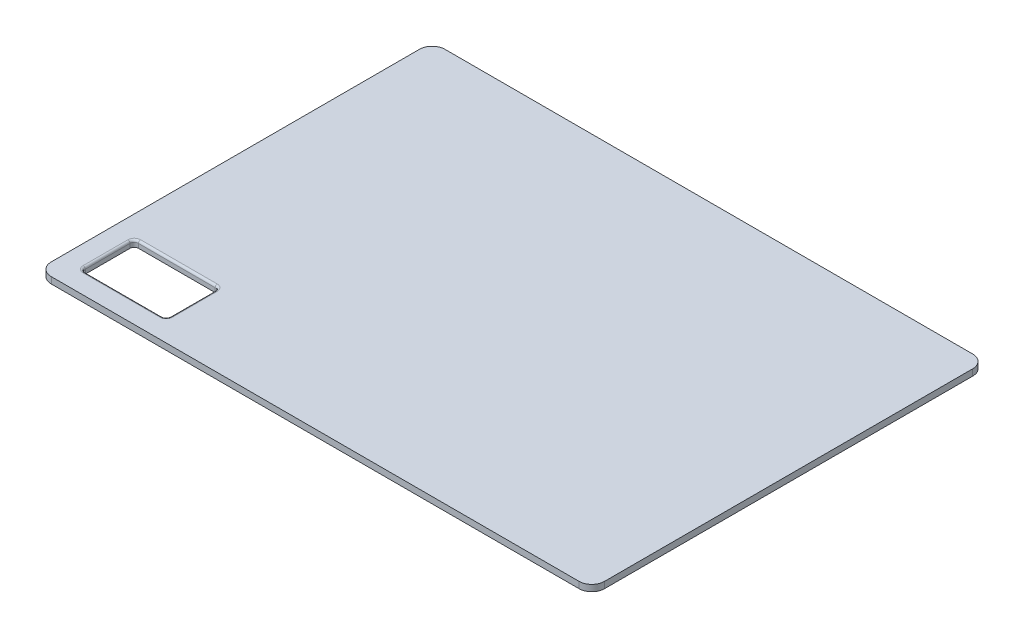
ISO-10303-21;
HEADER;
FILE_DESCRIPTION(('STEP AP214'),'2;1');
FILE_NAME('part.step','',(''),(''),'','','');
FILE_SCHEMA(('AUTOMOTIVE_DESIGN { 1 0 10303 214 1 1 1 1 }'));
ENDSEC;
DATA;
#1=APPLICATION_CONTEXT('core data for automotive mechanical design processes');
#2=APPLICATION_PROTOCOL_DEFINITION('international standard','automotive_design',2000,#1);
#3=PRODUCT_CONTEXT('',#1,'mechanical');
#4=PRODUCT('Part','Part','',(#3));
#5=PRODUCT_RELATED_PRODUCT_CATEGORY('part','',(#4));
#6=PRODUCT_DEFINITION_FORMATION('','',#4);
#7=PRODUCT_DEFINITION_CONTEXT('part definition',#1,'design');
#8=PRODUCT_DEFINITION('design','',#6,#7);
#9=PRODUCT_DEFINITION_SHAPE('','',#8);
#10=(LENGTH_UNIT() NAMED_UNIT(*) SI_UNIT(.MILLI.,.METRE.));
#11=(NAMED_UNIT(*) PLANE_ANGLE_UNIT() SI_UNIT($,.RADIAN.));
#12=(NAMED_UNIT(*) SI_UNIT($,.STERADIAN.) SOLID_ANGLE_UNIT());
#13=UNCERTAINTY_MEASURE_WITH_UNIT(LENGTH_MEASURE(1.E-05),#10,'distance_accuracy_value','');
#14=(GEOMETRIC_REPRESENTATION_CONTEXT(3) GLOBAL_UNCERTAINTY_ASSIGNED_CONTEXT((#13)) GLOBAL_UNIT_ASSIGNED_CONTEXT((#10,
#11,#12)) REPRESENTATION_CONTEXT('',''));
#15=CARTESIAN_POINT('',(0.,0.,0.));
#16=DIRECTION('',(0.,0.,1.));
#17=DIRECTION('',(1.,0.,0.));
#18=AXIS2_PLACEMENT_3D('',#15,#16,#17);
#19=CARTESIAN_POINT('',(0.,3.,0.));
#20=DIRECTION('',(1.,0.,0.));
#21=DIRECTION('',(0.,0.,-1.));
#22=AXIS2_PLACEMENT_3D('',#19,#20,#21);
#23=PLANE('',#22);
#24=DIRECTION('',(0.,0.,1.));
#25=VECTOR('',#24,1.);
#26=CARTESIAN_POINT('',(0.,3.,0.));
#27=LINE('',#26,#25);
#28=CARTESIAN_POINT('',(0.,3.,-179.));
#29=VERTEX_POINT('',#28);
#30=CARTESIAN_POINT('',(0.,3.,-6.));
#31=VERTEX_POINT('',#30);
#32=EDGE_CURVE('E191',#29,#31,#27,.T.);
#33=ORIENTED_EDGE('',*,*,#32,.F.);
#34=DIRECTION('',(0.,-1.,0.));
#35=VECTOR('',#34,1.);
#36=CARTESIAN_POINT('',(0.,3.,-179.));
#37=LINE('',#36,#35);
#38=CARTESIAN_POINT('',(0.,0.,-179.));
#39=VERTEX_POINT('',#38);
#40=EDGE_CURVE('E176',#29,#39,#37,.T.);
#41=ORIENTED_EDGE('',*,*,#40,.T.);
#42=DIRECTION('',(0.,0.,1.));
#43=VECTOR('',#42,1.);
#44=CARTESIAN_POINT('',(0.,0.,0.));
#45=LINE('',#44,#43);
#46=CARTESIAN_POINT('',(0.,0.,-6.));
#47=VERTEX_POINT('',#46);
#48=EDGE_CURVE('E188',#39,#47,#45,.T.);
#49=ORIENTED_EDGE('',*,*,#48,.T.);
#50=DIRECTION('',(0.,-1.,0.));
#51=VECTOR('',#50,1.);
#52=CARTESIAN_POINT('',(0.,3.,-6.));
#53=LINE('',#52,#51);
#54=EDGE_CURVE('E193',#47,#31,#53,.F.);
#55=ORIENTED_EDGE('',*,*,#54,.T.);
#56=EDGE_LOOP('',(#33,#41,#49,#55));
#57=FACE_BOUND('',#56,.T.);
#58=ADVANCED_FACE('F34',(#57),#23,.F.);
#59=CARTESIAN_POINT('',(0.,3.,0.));
#60=DIRECTION('',(0.,0.,-1.));
#61=DIRECTION('',(-1.,0.,0.));
#62=AXIS2_PLACEMENT_3D('',#59,#60,#61);
#63=PLANE('',#62);
#64=DIRECTION('',(1.,0.,0.));
#65=VECTOR('',#64,1.);
#66=CARTESIAN_POINT('',(0.,0.,0.));
#67=LINE('',#66,#65);
#68=CARTESIAN_POINT('',(6.,0.,0.));
#69=VERTEX_POINT('',#68);
#70=CARTESIAN_POINT('',(254.,0.,0.));
#71=VERTEX_POINT('',#70);
#72=EDGE_CURVE('E197',#69,#71,#67,.T.);
#73=ORIENTED_EDGE('',*,*,#72,.T.);
#74=DIRECTION('',(0.,-1.,0.));
#75=VECTOR('',#74,1.);
#76=CARTESIAN_POINT('',(254.,3.,0.));
#77=LINE('',#76,#75);
#78=CARTESIAN_POINT('',(254.,3.,0.));
#79=VERTEX_POINT('',#78);
#80=EDGE_CURVE('E238',#71,#79,#77,.F.);
#81=ORIENTED_EDGE('',*,*,#80,.T.);
#82=DIRECTION('',(1.,0.,0.));
#83=VECTOR('',#82,1.);
#84=CARTESIAN_POINT('',(0.,3.,0.));
#85=LINE('',#84,#83);
#86=CARTESIAN_POINT('',(6.,3.,0.));
#87=VERTEX_POINT('',#86);
#88=EDGE_CURVE('E336',#87,#79,#85,.T.);
#89=ORIENTED_EDGE('',*,*,#88,.F.);
#90=DIRECTION('',(0.,-1.,0.));
#91=VECTOR('',#90,1.);
#92=CARTESIAN_POINT('',(6.,3.,0.));
#93=LINE('',#92,#91);
#94=EDGE_CURVE('E235',#87,#69,#93,.T.);
#95=ORIENTED_EDGE('',*,*,#94,.T.);
#96=EDGE_LOOP('',(#73,#81,#89,#95));
#97=FACE_BOUND('',#96,.T.);
#98=ADVANCED_FACE('F361',(#97),#63,.F.);
#99=CARTESIAN_POINT('',(260.,3.,0.));
#100=DIRECTION('',(-1.,0.,0.));
#101=DIRECTION('',(0.,0.,1.));
#102=AXIS2_PLACEMENT_3D('',#99,#100,#101);
#103=PLANE('',#102);
#104=DIRECTION('',(0.,0.,-1.));
#105=VECTOR('',#104,1.);
#106=CARTESIAN_POINT('',(260.,0.,0.));
#107=LINE('',#106,#105);
#108=CARTESIAN_POINT('',(260.,0.,-6.));
#109=VERTEX_POINT('',#108);
#110=CARTESIAN_POINT('',(260.,0.,-179.));
#111=VERTEX_POINT('',#110);
#112=EDGE_CURVE('E201',#109,#111,#107,.T.);
#113=ORIENTED_EDGE('',*,*,#112,.T.);
#114=DIRECTION('',(0.,-1.,0.));
#115=VECTOR('',#114,1.);
#116=CARTESIAN_POINT('',(260.,3.,-179.));
#117=LINE('',#116,#115);
#118=CARTESIAN_POINT('',(260.,3.,-179.));
#119=VERTEX_POINT('',#118);
#120=EDGE_CURVE('E233',#111,#119,#117,.F.);
#121=ORIENTED_EDGE('',*,*,#120,.T.);
#122=DIRECTION('',(0.,0.,-1.));
#123=VECTOR('',#122,1.);
#124=CARTESIAN_POINT('',(260.,3.,0.));
#125=LINE('',#124,#123);
#126=CARTESIAN_POINT('',(260.,3.,-6.));
#127=VERTEX_POINT('',#126);
#128=EDGE_CURVE('E338',#127,#119,#125,.T.);
#129=ORIENTED_EDGE('',*,*,#128,.F.);
#130=DIRECTION('',(0.,-1.,0.));
#131=VECTOR('',#130,1.);
#132=CARTESIAN_POINT('',(260.,3.,-6.));
#133=LINE('',#132,#131);
#134=EDGE_CURVE('E230',#127,#109,#133,.T.);
#135=ORIENTED_EDGE('',*,*,#134,.T.);
#136=EDGE_LOOP('',(#113,#121,#129,#135));
#137=FACE_BOUND('',#136,.T.);
#138=ADVANCED_FACE('F354',(#137),#103,.F.);
#139=CARTESIAN_POINT('',(0.,3.,-185.));
#140=DIRECTION('',(0.,0.,1.));
#141=DIRECTION('',(1.,0.,0.));
#142=AXIS2_PLACEMENT_3D('',#139,#140,#141);
#143=PLANE('',#142);
#144=DIRECTION('',(-1.,0.,0.));
#145=VECTOR('',#144,1.);
#146=CARTESIAN_POINT('',(0.,0.,-185.));
#147=LINE('',#146,#145);
#148=CARTESIAN_POINT('',(254.,0.,-185.));
#149=VERTEX_POINT('',#148);
#150=CARTESIAN_POINT('',(6.,0.,-185.));
#151=VERTEX_POINT('',#150);
#152=EDGE_CURVE('E212',#149,#151,#147,.T.);
#153=ORIENTED_EDGE('',*,*,#152,.T.);
#154=DIRECTION('',(0.,-1.,0.));
#155=VECTOR('',#154,1.);
#156=CARTESIAN_POINT('',(6.,3.,-185.));
#157=LINE('',#156,#155);
#158=CARTESIAN_POINT('',(6.,3.,-185.));
#159=VERTEX_POINT('',#158);
#160=EDGE_CURVE('E177',#151,#159,#157,.F.);
#161=ORIENTED_EDGE('',*,*,#160,.T.);
#162=DIRECTION('',(-1.,0.,0.));
#163=VECTOR('',#162,1.);
#164=CARTESIAN_POINT('',(0.,3.,-185.));
#165=LINE('',#164,#163);
#166=CARTESIAN_POINT('',(254.,3.,-185.));
#167=VERTEX_POINT('',#166);
#168=EDGE_CURVE('E207',#167,#159,#165,.T.);
#169=ORIENTED_EDGE('',*,*,#168,.F.);
#170=DIRECTION('',(0.,-1.,0.));
#171=VECTOR('',#170,1.);
#172=CARTESIAN_POINT('',(254.,3.,-185.));
#173=LINE('',#172,#171);
#174=EDGE_CURVE('E182',#167,#149,#173,.T.);
#175=ORIENTED_EDGE('',*,*,#174,.T.);
#176=EDGE_LOOP('',(#153,#161,#169,#175));
#177=FACE_BOUND('',#176,.T.);
#178=ADVANCED_FACE('F348',(#177),#143,.F.);
#179=CARTESIAN_POINT('',(0.,3.,-185.));
#180=DIRECTION('',(0.,-1.,0.));
#181=DIRECTION('',(0.,0.,-1.));
#182=AXIS2_PLACEMENT_3D('',#179,#180,#181);
#183=PLANE('',#182);
#184=DIRECTION('',(1.,0.,0.));
#185=VECTOR('',#184,1.);
#186=CARTESIAN_POINT('',(0.,3.,-9.00000000000001));
#187=LINE('',#186,#185);
#188=CARTESIAN_POINT('',(48.,3.,-9.00000000000001));
#189=VERTEX_POINT('',#188);
#190=CARTESIAN_POINT('',(12.,3.,-9.));
#191=VERTEX_POINT('',#190);
#192=EDGE_CURVE('E266',#189,#191,#187,.F.);
#193=ORIENTED_EDGE('',*,*,#192,.T.);
#194=CARTESIAN_POINT('',(12.,3.,-12.));
#195=DIRECTION('',(0.,-1.,0.));
#196=DIRECTION('',(0.,0.,-1.));
#197=AXIS2_PLACEMENT_3D('',#194,#195,#196);
#198=CIRCLE('',#197,3.);
#199=CARTESIAN_POINT('',(9.,3.,-12.));
#200=VERTEX_POINT('',#199);
#201=EDGE_CURVE('E280',#191,#200,#198,.T.);
#202=ORIENTED_EDGE('',*,*,#201,.T.);
#203=DIRECTION('',(0.,0.,1.));
#204=VECTOR('',#203,1.);
#205=CARTESIAN_POINT('',(8.99999999999998,3.,-185.));
#206=LINE('',#205,#204);
#207=CARTESIAN_POINT('',(9.,3.,-33.));
#208=VERTEX_POINT('',#207);
#209=EDGE_CURVE('E278',#200,#208,#206,.F.);
#210=ORIENTED_EDGE('',*,*,#209,.T.);
#211=CARTESIAN_POINT('',(12.,3.,-33.));
#212=DIRECTION('',(0.,-1.,0.));
#213=DIRECTION('',(0.,0.,-1.));
#214=AXIS2_PLACEMENT_3D('',#211,#212,#213);
#215=CIRCLE('',#214,3.);
#216=CARTESIAN_POINT('',(12.,3.,-36.));
#217=VERTEX_POINT('',#216);
#218=EDGE_CURVE('E276',#208,#217,#215,.T.);
#219=ORIENTED_EDGE('',*,*,#218,.T.);
#220=DIRECTION('',(-1.,0.,0.));
#221=VECTOR('',#220,1.);
#222=CARTESIAN_POINT('',(0.,3.,-36.));
#223=LINE('',#222,#221);
#224=CARTESIAN_POINT('',(48.,3.,-36.));
#225=VERTEX_POINT('',#224);
#226=EDGE_CURVE('E274',#217,#225,#223,.F.);
#227=ORIENTED_EDGE('',*,*,#226,.T.);
#228=CARTESIAN_POINT('',(48.,3.,-33.));
#229=DIRECTION('',(0.,-1.,0.));
#230=DIRECTION('',(0.,0.,-1.));
#231=AXIS2_PLACEMENT_3D('',#228,#229,#230);
#232=CIRCLE('',#231,3.);
#233=CARTESIAN_POINT('',(51.,3.,-33.));
#234=VERTEX_POINT('',#233);
#235=EDGE_CURVE('E272',#225,#234,#232,.T.);
#236=ORIENTED_EDGE('',*,*,#235,.T.);
#237=DIRECTION('',(0.,0.,-1.));
#238=VECTOR('',#237,1.);
#239=CARTESIAN_POINT('',(51.,3.,-185.));
#240=LINE('',#239,#238);
#241=CARTESIAN_POINT('',(51.,3.,-12.));
#242=VERTEX_POINT('',#241);
#243=EDGE_CURVE('E270',#234,#242,#240,.F.);
#244=ORIENTED_EDGE('',*,*,#243,.T.);
#245=CARTESIAN_POINT('',(48.,3.,-12.));
#246=DIRECTION('',(0.,-1.,0.));
#247=DIRECTION('',(0.,0.,-1.));
#248=AXIS2_PLACEMENT_3D('',#245,#246,#247);
#249=CIRCLE('',#248,3.);
#250=EDGE_CURVE('E268',#242,#189,#249,.T.);
#251=ORIENTED_EDGE('',*,*,#250,.T.);
#252=EDGE_LOOP('',(#193,#202,#210,#219,#227,#236,#244,#251));
#253=FACE_BOUND('',#252,.T.);
#254=ORIENTED_EDGE('',*,*,#168,.T.);
#255=CARTESIAN_POINT('',(6.,3.,-179.));
#256=DIRECTION('',(0.,-1.,0.));
#257=DIRECTION('',(0.,0.,-1.));
#258=AXIS2_PLACEMENT_3D('',#255,#256,#257);
#259=CIRCLE('',#258,6.);
#260=EDGE_CURVE('E228',#159,#29,#259,.F.);
#261=ORIENTED_EDGE('',*,*,#260,.T.);
#262=ORIENTED_EDGE('',*,*,#32,.T.);
#263=CARTESIAN_POINT('',(6.,3.,-6.));
#264=DIRECTION('',(0.,-1.,0.));
#265=DIRECTION('',(0.,0.,-1.));
#266=AXIS2_PLACEMENT_3D('',#263,#264,#265);
#267=CIRCLE('',#266,6.);
#268=EDGE_CURVE('E222',#31,#87,#267,.F.);
#269=ORIENTED_EDGE('',*,*,#268,.T.);
#270=ORIENTED_EDGE('',*,*,#88,.T.);
#271=CARTESIAN_POINT('',(254.,3.,-6.));
#272=DIRECTION('',(0.,-1.,0.));
#273=DIRECTION('',(0.,0.,-1.));
#274=AXIS2_PLACEMENT_3D('',#271,#272,#273);
#275=CIRCLE('',#274,6.);
#276=EDGE_CURVE('E224',#79,#127,#275,.F.);
#277=ORIENTED_EDGE('',*,*,#276,.T.);
#278=ORIENTED_EDGE('',*,*,#128,.T.);
#279=CARTESIAN_POINT('',(254.,3.,-179.));
#280=DIRECTION('',(0.,-1.,0.));
#281=DIRECTION('',(0.,0.,-1.));
#282=AXIS2_PLACEMENT_3D('',#279,#280,#281);
#283=CIRCLE('',#282,6.);
#284=EDGE_CURVE('E226',#119,#167,#283,.F.);
#285=ORIENTED_EDGE('',*,*,#284,.T.);
#286=EDGE_LOOP('',(#254,#261,#262,#269,#270,#277,#278,#285));
#287=FACE_BOUND('',#286,.T.);
#288=ADVANCED_FACE('F345',(#253,#287),#183,.F.);
#289=CARTESIAN_POINT('',(0.,0.,-185.));
#290=DIRECTION('',(0.,-1.,0.));
#291=DIRECTION('',(0.,0.,-1.));
#292=AXIS2_PLACEMENT_3D('',#289,#290,#291);
#293=PLANE('',#292);
#294=DIRECTION('',(-1.,0.,0.));
#295=VECTOR('',#294,1.);
#296=CARTESIAN_POINT('',(10.,0.,-35.));
#297=LINE('',#296,#295);
#298=CARTESIAN_POINT('',(48.,0.,-35.));
#299=VERTEX_POINT('',#298);
#300=CARTESIAN_POINT('',(12.,0.,-35.));
#301=VERTEX_POINT('',#300);
#302=EDGE_CURVE('E198',#299,#301,#297,.T.);
#303=ORIENTED_EDGE('',*,*,#302,.T.);
#304=CARTESIAN_POINT('',(12.,0.,-33.));
#305=DIRECTION('',(0.,-1.,0.));
#306=DIRECTION('',(0.,0.,-1.));
#307=AXIS2_PLACEMENT_3D('',#304,#305,#306);
#308=CIRCLE('',#307,2.);
#309=CARTESIAN_POINT('',(10.,0.,-33.));
#310=VERTEX_POINT('',#309);
#311=EDGE_CURVE('E264',#301,#310,#308,.F.);
#312=ORIENTED_EDGE('',*,*,#311,.T.);
#313=DIRECTION('',(0.,0.,1.));
#314=VECTOR('',#313,1.);
#315=CARTESIAN_POINT('',(10.,0.,-10.));
#316=LINE('',#315,#314);
#317=CARTESIAN_POINT('',(10.,0.,-12.));
#318=VERTEX_POINT('',#317);
#319=EDGE_CURVE('E319',#310,#318,#316,.T.);
#320=ORIENTED_EDGE('',*,*,#319,.T.);
#321=CARTESIAN_POINT('',(12.,0.,-12.));
#322=DIRECTION('',(0.,-1.,0.));
#323=DIRECTION('',(0.,0.,-1.));
#324=AXIS2_PLACEMENT_3D('',#321,#322,#323);
#325=CIRCLE('',#324,2.);
#326=CARTESIAN_POINT('',(12.,0.,-10.));
#327=VERTEX_POINT('',#326);
#328=EDGE_CURVE('E262',#318,#327,#325,.F.);
#329=ORIENTED_EDGE('',*,*,#328,.T.);
#330=DIRECTION('',(1.,0.,0.));
#331=VECTOR('',#330,1.);
#332=CARTESIAN_POINT('',(10.,0.,-10.));
#333=LINE('',#332,#331);
#334=CARTESIAN_POINT('',(48.,0.,-10.));
#335=VERTEX_POINT('',#334);
#336=EDGE_CURVE('E325',#327,#335,#333,.T.);
#337=ORIENTED_EDGE('',*,*,#336,.T.);
#338=CARTESIAN_POINT('',(48.,0.,-12.));
#339=DIRECTION('',(0.,-1.,0.));
#340=DIRECTION('',(0.,0.,-1.));
#341=AXIS2_PLACEMENT_3D('',#338,#339,#340);
#342=CIRCLE('',#341,2.);
#343=CARTESIAN_POINT('',(50.,0.,-12.));
#344=VERTEX_POINT('',#343);
#345=EDGE_CURVE('E260',#335,#344,#342,.F.);
#346=ORIENTED_EDGE('',*,*,#345,.T.);
#347=DIRECTION('',(0.,0.,-1.));
#348=VECTOR('',#347,1.);
#349=CARTESIAN_POINT('',(50.,0.,-10.));
#350=LINE('',#349,#348);
#351=CARTESIAN_POINT('',(50.,0.,-33.));
#352=VERTEX_POINT('',#351);
#353=EDGE_CURVE('E204',#344,#352,#350,.T.);
#354=ORIENTED_EDGE('',*,*,#353,.T.);
#355=CARTESIAN_POINT('',(48.,0.,-33.));
#356=DIRECTION('',(0.,-1.,0.));
#357=DIRECTION('',(0.,0.,-1.));
#358=AXIS2_PLACEMENT_3D('',#355,#356,#357);
#359=CIRCLE('',#358,2.);
#360=EDGE_CURVE('E258',#352,#299,#359,.F.);
#361=ORIENTED_EDGE('',*,*,#360,.T.);
#362=EDGE_LOOP('',(#303,#312,#320,#329,#337,#346,#354,#361));
#363=FACE_BOUND('',#362,.T.);
#364=ORIENTED_EDGE('',*,*,#48,.F.);
#365=CARTESIAN_POINT('',(6.,0.,-179.));
#366=DIRECTION('',(0.,-1.,0.));
#367=DIRECTION('',(0.,0.,-1.));
#368=AXIS2_PLACEMENT_3D('',#365,#366,#367);
#369=CIRCLE('',#368,6.);
#370=EDGE_CURVE('E172',#39,#151,#369,.T.);
#371=ORIENTED_EDGE('',*,*,#370,.T.);
#372=ORIENTED_EDGE('',*,*,#152,.F.);
#373=CARTESIAN_POINT('',(254.,0.,-179.));
#374=DIRECTION('',(0.,-1.,0.));
#375=DIRECTION('',(0.,0.,-1.));
#376=AXIS2_PLACEMENT_3D('',#373,#374,#375);
#377=CIRCLE('',#376,6.);
#378=EDGE_CURVE('E183',#149,#111,#377,.T.);
#379=ORIENTED_EDGE('',*,*,#378,.T.);
#380=ORIENTED_EDGE('',*,*,#112,.F.);
#381=CARTESIAN_POINT('',(254.,0.,-6.));
#382=DIRECTION('',(0.,-1.,0.));
#383=DIRECTION('',(0.,0.,-1.));
#384=AXIS2_PLACEMENT_3D('',#381,#382,#383);
#385=CIRCLE('',#384,6.);
#386=EDGE_CURVE('E216',#109,#71,#385,.T.);
#387=ORIENTED_EDGE('',*,*,#386,.T.);
#388=ORIENTED_EDGE('',*,*,#72,.F.);
#389=CARTESIAN_POINT('',(6.,0.,-6.));
#390=DIRECTION('',(0.,-1.,0.));
#391=DIRECTION('',(0.,0.,-1.));
#392=AXIS2_PLACEMENT_3D('',#389,#390,#391);
#393=CIRCLE('',#392,6.);
#394=EDGE_CURVE('E192',#69,#47,#393,.T.);
#395=ORIENTED_EDGE('',*,*,#394,.T.);
#396=EDGE_LOOP('',(#364,#371,#372,#379,#380,#387,#388,#395));
#397=FACE_BOUND('',#396,.T.);
#398=ADVANCED_FACE('F195',(#363,#397),#293,.T.);
#399=CARTESIAN_POINT('',(6.,3.,-179.));
#400=DIRECTION('',(0.,-1.,0.));
#401=DIRECTION('',(0.,0.,-1.));
#402=AXIS2_PLACEMENT_3D('',#399,#400,#401);
#403=CYLINDRICAL_SURFACE('',#402,6.);
#404=ORIENTED_EDGE('',*,*,#260,.F.);
#405=ORIENTED_EDGE('',*,*,#160,.F.);
#406=ORIENTED_EDGE('',*,*,#370,.F.);
#407=ORIENTED_EDGE('',*,*,#40,.F.);
#408=EDGE_LOOP('',(#404,#405,#406,#407));
#409=FACE_BOUND('',#408,.T.);
#410=ADVANCED_FACE('F175',(#409),#403,.T.);
#411=CARTESIAN_POINT('',(254.,3.,-179.));
#412=DIRECTION('',(0.,-1.,0.));
#413=DIRECTION('',(0.,0.,-1.));
#414=AXIS2_PLACEMENT_3D('',#411,#412,#413);
#415=CYLINDRICAL_SURFACE('',#414,6.);
#416=ORIENTED_EDGE('',*,*,#284,.F.);
#417=ORIENTED_EDGE('',*,*,#120,.F.);
#418=ORIENTED_EDGE('',*,*,#378,.F.);
#419=ORIENTED_EDGE('',*,*,#174,.F.);
#420=EDGE_LOOP('',(#416,#417,#418,#419));
#421=FACE_BOUND('',#420,.T.);
#422=ADVANCED_FACE('F350',(#421),#415,.T.);
#423=CARTESIAN_POINT('',(254.,3.,-6.));
#424=DIRECTION('',(0.,-1.,0.));
#425=DIRECTION('',(0.,0.,-1.));
#426=AXIS2_PLACEMENT_3D('',#423,#424,#425);
#427=CYLINDRICAL_SURFACE('',#426,6.);
#428=ORIENTED_EDGE('',*,*,#276,.F.);
#429=ORIENTED_EDGE('',*,*,#80,.F.);
#430=ORIENTED_EDGE('',*,*,#386,.F.);
#431=ORIENTED_EDGE('',*,*,#134,.F.);
#432=EDGE_LOOP('',(#428,#429,#430,#431));
#433=FACE_BOUND('',#432,.T.);
#434=ADVANCED_FACE('F358',(#433),#427,.T.);
#435=CARTESIAN_POINT('',(6.,3.,-6.));
#436=DIRECTION('',(0.,-1.,0.));
#437=DIRECTION('',(0.,0.,-1.));
#438=AXIS2_PLACEMENT_3D('',#435,#436,#437);
#439=CYLINDRICAL_SURFACE('',#438,6.);
#440=ORIENTED_EDGE('',*,*,#268,.F.);
#441=ORIENTED_EDGE('',*,*,#54,.F.);
#442=ORIENTED_EDGE('',*,*,#394,.F.);
#443=ORIENTED_EDGE('',*,*,#94,.F.);
#444=EDGE_LOOP('',(#440,#441,#442,#443));
#445=FACE_BOUND('',#444,.T.);
#446=ADVANCED_FACE('F366',(#445),#439,.T.);
#447=CARTESIAN_POINT('',(10.,0.,-10.));
#448=DIRECTION('',(-1.,0.,0.));
#449=DIRECTION('',(0.,0.,1.));
#450=AXIS2_PLACEMENT_3D('',#447,#448,#449);
#451=PLANE('',#450);
#452=DIRECTION('',(0.,1.,0.));
#453=VECTOR('',#452,1.);
#454=CARTESIAN_POINT('',(10.,3.,-33.));
#455=LINE('',#454,#453);
#456=CARTESIAN_POINT('',(10.,2.,-33.));
#457=VERTEX_POINT('',#456);
#458=EDGE_CURVE('E253',#310,#457,#455,.T.);
#459=ORIENTED_EDGE('',*,*,#458,.T.);
#460=DIRECTION('',(0.,0.,1.));
#461=VECTOR('',#460,1.);
#462=CARTESIAN_POINT('',(10.,2.,-10.));
#463=LINE('',#462,#461);
#464=CARTESIAN_POINT('',(10.,2.,-12.));
#465=VERTEX_POINT('',#464);
#466=EDGE_CURVE('E286',#457,#465,#463,.T.);
#467=ORIENTED_EDGE('',*,*,#466,.T.);
#468=DIRECTION('',(0.,1.,0.));
#469=VECTOR('',#468,1.);
#470=CARTESIAN_POINT('',(10.,0.,-12.));
#471=LINE('',#470,#469);
#472=EDGE_CURVE('E256',#465,#318,#471,.F.);
#473=ORIENTED_EDGE('',*,*,#472,.T.);
#474=ORIENTED_EDGE('',*,*,#319,.F.);
#475=EDGE_LOOP('',(#459,#467,#473,#474));
#476=FACE_BOUND('',#475,.T.);
#477=ADVANCED_FACE('F368',(#476),#451,.F.);
#478=CARTESIAN_POINT('',(10.,0.,-35.));
#479=DIRECTION('',(0.,0.,-1.));
#480=DIRECTION('',(-1.,0.,0.));
#481=AXIS2_PLACEMENT_3D('',#478,#479,#480);
#482=PLANE('',#481);
#483=DIRECTION('',(0.,1.,0.));
#484=VECTOR('',#483,1.);
#485=CARTESIAN_POINT('',(48.,3.,-35.));
#486=LINE('',#485,#484);
#487=CARTESIAN_POINT('',(48.,2.,-35.));
#488=VERTEX_POINT('',#487);
#489=EDGE_CURVE('E242',#299,#488,#486,.T.);
#490=ORIENTED_EDGE('',*,*,#489,.T.);
#491=DIRECTION('',(-1.,0.,0.));
#492=VECTOR('',#491,1.);
#493=CARTESIAN_POINT('',(10.,2.,-35.));
#494=LINE('',#493,#492);
#495=CARTESIAN_POINT('',(12.,2.,-35.));
#496=VERTEX_POINT('',#495);
#497=EDGE_CURVE('E290',#488,#496,#494,.T.);
#498=ORIENTED_EDGE('',*,*,#497,.T.);
#499=DIRECTION('',(0.,1.,0.));
#500=VECTOR('',#499,1.);
#501=CARTESIAN_POINT('',(12.,0.,-35.));
#502=LINE('',#501,#500);
#503=EDGE_CURVE('E240',#496,#301,#502,.F.);
#504=ORIENTED_EDGE('',*,*,#503,.T.);
#505=ORIENTED_EDGE('',*,*,#302,.F.);
#506=EDGE_LOOP('',(#490,#498,#504,#505));
#507=FACE_BOUND('',#506,.T.);
#508=ADVANCED_FACE('F374',(#507),#482,.F.);
#509=CARTESIAN_POINT('',(50.,0.,-10.));
#510=DIRECTION('',(1.,0.,0.));
#511=DIRECTION('',(0.,0.,-1.));
#512=AXIS2_PLACEMENT_3D('',#509,#510,#511);
#513=PLANE('',#512);
#514=DIRECTION('',(0.,1.,0.));
#515=VECTOR('',#514,1.);
#516=CARTESIAN_POINT('',(50.,3.,-12.));
#517=LINE('',#516,#515);
#518=CARTESIAN_POINT('',(50.,2.,-12.));
#519=VERTEX_POINT('',#518);
#520=EDGE_CURVE('E245',#344,#519,#517,.T.);
#521=ORIENTED_EDGE('',*,*,#520,.T.);
#522=DIRECTION('',(0.,0.,-1.));
#523=VECTOR('',#522,1.);
#524=CARTESIAN_POINT('',(50.,2.,-10.));
#525=LINE('',#524,#523);
#526=CARTESIAN_POINT('',(50.,2.,-33.));
#527=VERTEX_POINT('',#526);
#528=EDGE_CURVE('E294',#519,#527,#525,.T.);
#529=ORIENTED_EDGE('',*,*,#528,.T.);
#530=DIRECTION('',(0.,1.,0.));
#531=VECTOR('',#530,1.);
#532=CARTESIAN_POINT('',(50.,0.,-33.));
#533=LINE('',#532,#531);
#534=EDGE_CURVE('E247',#527,#352,#533,.F.);
#535=ORIENTED_EDGE('',*,*,#534,.T.);
#536=ORIENTED_EDGE('',*,*,#353,.F.);
#537=EDGE_LOOP('',(#521,#529,#535,#536));
#538=FACE_BOUND('',#537,.T.);
#539=ADVANCED_FACE('F437',(#538),#513,.F.);
#540=CARTESIAN_POINT('',(10.,0.,-10.));
#541=DIRECTION('',(0.,0.,1.));
#542=DIRECTION('',(1.,0.,0.));
#543=AXIS2_PLACEMENT_3D('',#540,#541,#542);
#544=PLANE('',#543);
#545=DIRECTION('',(0.,1.,0.));
#546=VECTOR('',#545,1.);
#547=CARTESIAN_POINT('',(12.,3.,-10.));
#548=LINE('',#547,#546);
#549=CARTESIAN_POINT('',(12.,2.,-10.));
#550=VERTEX_POINT('',#549);
#551=EDGE_CURVE('E249',#327,#550,#548,.T.);
#552=ORIENTED_EDGE('',*,*,#551,.T.);
#553=DIRECTION('',(1.,0.,0.));
#554=VECTOR('',#553,1.);
#555=CARTESIAN_POINT('',(10.,2.,-10.));
#556=LINE('',#555,#554);
#557=CARTESIAN_POINT('',(48.,2.,-10.));
#558=VERTEX_POINT('',#557);
#559=EDGE_CURVE('E11',#550,#558,#556,.T.);
#560=ORIENTED_EDGE('',*,*,#559,.T.);
#561=DIRECTION('',(0.,1.,0.));
#562=VECTOR('',#561,1.);
#563=CARTESIAN_POINT('',(48.,0.,-10.));
#564=LINE('',#563,#562);
#565=EDGE_CURVE('E251',#558,#335,#564,.F.);
#566=ORIENTED_EDGE('',*,*,#565,.T.);
#567=ORIENTED_EDGE('',*,*,#336,.F.);
#568=EDGE_LOOP('',(#552,#560,#566,#567));
#569=FACE_BOUND('',#568,.T.);
#570=ADVANCED_FACE('F447',(#569),#544,.F.);
#571=CARTESIAN_POINT('',(48.,0.,-33.));
#572=DIRECTION('',(0.,-1.,0.));
#573=DIRECTION('',(0.,0.,-1.));
#574=AXIS2_PLACEMENT_3D('',#571,#572,#573);
#575=CYLINDRICAL_SURFACE('',#574,2.);
#576=ORIENTED_EDGE('',*,*,#534,.F.);
#577=CARTESIAN_POINT('',(48.,2.,-33.));
#578=DIRECTION('',(0.,-1.,0.));
#579=DIRECTION('',(0.,0.,-1.));
#580=AXIS2_PLACEMENT_3D('',#577,#578,#579);
#581=CIRCLE('',#580,2.);
#582=EDGE_CURVE('E292',#527,#488,#581,.F.);
#583=ORIENTED_EDGE('',*,*,#582,.T.);
#584=ORIENTED_EDGE('',*,*,#489,.F.);
#585=ORIENTED_EDGE('',*,*,#360,.F.);
#586=EDGE_LOOP('',(#576,#583,#584,#585));
#587=FACE_BOUND('',#586,.T.);
#588=ADVANCED_FACE('F457',(#587),#575,.F.);
#589=CARTESIAN_POINT('',(48.,0.,-12.));
#590=DIRECTION('',(0.,-1.,0.));
#591=DIRECTION('',(0.,0.,-1.));
#592=AXIS2_PLACEMENT_3D('',#589,#590,#591);
#593=CYLINDRICAL_SURFACE('',#592,2.);
#594=ORIENTED_EDGE('',*,*,#565,.F.);
#595=CARTESIAN_POINT('',(48.,2.,-12.));
#596=DIRECTION('',(0.,-1.,0.));
#597=DIRECTION('',(0.,0.,-1.));
#598=AXIS2_PLACEMENT_3D('',#595,#596,#597);
#599=CIRCLE('',#598,2.);
#600=EDGE_CURVE('E43',#558,#519,#599,.F.);
#601=ORIENTED_EDGE('',*,*,#600,.T.);
#602=ORIENTED_EDGE('',*,*,#520,.F.);
#603=ORIENTED_EDGE('',*,*,#345,.F.);
#604=EDGE_LOOP('',(#594,#601,#602,#603));
#605=FACE_BOUND('',#604,.T.);
#606=ADVANCED_FACE('F466',(#605),#593,.F.);
#607=CARTESIAN_POINT('',(12.,0.,-12.));
#608=DIRECTION('',(0.,-1.,0.));
#609=DIRECTION('',(0.,0.,-1.));
#610=AXIS2_PLACEMENT_3D('',#607,#608,#609);
#611=CYLINDRICAL_SURFACE('',#610,2.);
#612=ORIENTED_EDGE('',*,*,#472,.F.);
#613=CARTESIAN_POINT('',(12.,2.,-12.));
#614=DIRECTION('',(0.,-1.,0.));
#615=DIRECTION('',(0.,0.,-1.));
#616=AXIS2_PLACEMENT_3D('',#613,#614,#615);
#617=CIRCLE('',#616,2.);
#618=EDGE_CURVE('E283',#465,#550,#617,.F.);
#619=ORIENTED_EDGE('',*,*,#618,.T.);
#620=ORIENTED_EDGE('',*,*,#551,.F.);
#621=ORIENTED_EDGE('',*,*,#328,.F.);
#622=EDGE_LOOP('',(#612,#619,#620,#621));
#623=FACE_BOUND('',#622,.T.);
#624=ADVANCED_FACE('F475',(#623),#611,.F.);
#625=CARTESIAN_POINT('',(12.,0.,-33.));
#626=DIRECTION('',(0.,-1.,0.));
#627=DIRECTION('',(0.,0.,-1.));
#628=AXIS2_PLACEMENT_3D('',#625,#626,#627);
#629=CYLINDRICAL_SURFACE('',#628,2.);
#630=ORIENTED_EDGE('',*,*,#503,.F.);
#631=CARTESIAN_POINT('',(12.,2.,-33.));
#632=DIRECTION('',(0.,-1.,0.));
#633=DIRECTION('',(0.,0.,-1.));
#634=AXIS2_PLACEMENT_3D('',#631,#632,#633);
#635=CIRCLE('',#634,2.);
#636=EDGE_CURVE('E288',#496,#457,#635,.F.);
#637=ORIENTED_EDGE('',*,*,#636,.T.);
#638=ORIENTED_EDGE('',*,*,#458,.F.);
#639=ORIENTED_EDGE('',*,*,#311,.F.);
#640=EDGE_LOOP('',(#630,#637,#638,#639));
#641=FACE_BOUND('',#640,.T.);
#642=ADVANCED_FACE('F484',(#641),#629,.F.);
#643=CARTESIAN_POINT('',(48.,2.,-33.));
#644=DIRECTION('',(0.,-1.,0.));
#645=DIRECTION('',(0.,0.,-1.));
#646=AXIS2_PLACEMENT_3D('',#643,#644,#645);
#647=TOROIDAL_SURFACE('',#646,3.,1.);
#648=CARTESIAN_POINT('',(48.,2.,-36.));
#649=DIRECTION('',(-1.,0.,0.));
#650=DIRECTION('',(0.,0.,1.));
#651=AXIS2_PLACEMENT_3D('',#648,#649,#650);
#652=CIRCLE('',#651,1.);
#653=EDGE_CURVE('E312',#488,#225,#652,.T.);
#654=ORIENTED_EDGE('',*,*,#653,.F.);
#655=ORIENTED_EDGE('',*,*,#582,.F.);
#656=CARTESIAN_POINT('',(51.,2.,-33.));
#657=DIRECTION('',(0.,0.,1.));
#658=DIRECTION('',(1.,0.,0.));
#659=AXIS2_PLACEMENT_3D('',#656,#657,#658);
#660=CIRCLE('',#659,1.);
#661=EDGE_CURVE('E38',#234,#527,#660,.T.);
#662=ORIENTED_EDGE('',*,*,#661,.F.);
#663=ORIENTED_EDGE('',*,*,#235,.F.);
#664=EDGE_LOOP('',(#654,#655,#662,#663));
#665=FACE_BOUND('',#664,.T.);
#666=ADVANCED_FACE('F36',(#665),#647,.T.);
#667=CARTESIAN_POINT('',(51.,2.,-10.));
#668=DIRECTION('',(0.,0.,-1.));
#669=DIRECTION('',(-1.,0.,0.));
#670=AXIS2_PLACEMENT_3D('',#667,#668,#669);
#671=CYLINDRICAL_SURFACE('',#670,1.);
#672=ORIENTED_EDGE('',*,*,#661,.T.);
#673=ORIENTED_EDGE('',*,*,#528,.F.);
#674=CARTESIAN_POINT('',(51.,2.,-12.));
#675=DIRECTION('',(0.,0.,1.));
#676=DIRECTION('',(1.,0.,0.));
#677=AXIS2_PLACEMENT_3D('',#674,#675,#676);
#678=CIRCLE('',#677,1.);
#679=EDGE_CURVE('E310',#242,#519,#678,.T.);
#680=ORIENTED_EDGE('',*,*,#679,.F.);
#681=ORIENTED_EDGE('',*,*,#243,.F.);
#682=EDGE_LOOP('',(#672,#673,#680,#681));
#683=FACE_BOUND('',#682,.T.);
#684=ADVANCED_FACE('F503',(#683),#671,.T.);
#685=CARTESIAN_POINT('',(10.,2.,-36.));
#686=DIRECTION('',(-1.,0.,0.));
#687=DIRECTION('',(0.,0.,1.));
#688=AXIS2_PLACEMENT_3D('',#685,#686,#687);
#689=CYLINDRICAL_SURFACE('',#688,1.);
#690=ORIENTED_EDGE('',*,*,#653,.T.);
#691=ORIENTED_EDGE('',*,*,#226,.F.);
#692=CARTESIAN_POINT('',(12.,2.,-36.));
#693=DIRECTION('',(-1.,0.,0.));
#694=DIRECTION('',(0.,0.,1.));
#695=AXIS2_PLACEMENT_3D('',#692,#693,#694);
#696=CIRCLE('',#695,1.);
#697=EDGE_CURVE('E307',#496,#217,#696,.T.);
#698=ORIENTED_EDGE('',*,*,#697,.F.);
#699=ORIENTED_EDGE('',*,*,#497,.F.);
#700=EDGE_LOOP('',(#690,#691,#698,#699));
#701=FACE_BOUND('',#700,.T.);
#702=ADVANCED_FACE('F513',(#701),#689,.T.);
#703=CARTESIAN_POINT('',(48.,2.,-12.));
#704=DIRECTION('',(0.,-1.,0.));
#705=DIRECTION('',(0.,0.,-1.));
#706=AXIS2_PLACEMENT_3D('',#703,#704,#705);
#707=TOROIDAL_SURFACE('',#706,3.,1.);
#708=ORIENTED_EDGE('',*,*,#679,.T.);
#709=ORIENTED_EDGE('',*,*,#600,.F.);
#710=CARTESIAN_POINT('',(48.,2.,-9.00000000000001));
#711=DIRECTION('',(-1.,0.,0.));
#712=DIRECTION('',(0.,0.,1.));
#713=AXIS2_PLACEMENT_3D('',#710,#711,#712);
#714=CIRCLE('',#713,1.);
#715=EDGE_CURVE('E304',#189,#558,#714,.T.);
#716=ORIENTED_EDGE('',*,*,#715,.F.);
#717=ORIENTED_EDGE('',*,*,#250,.F.);
#718=EDGE_LOOP('',(#708,#709,#716,#717));
#719=FACE_BOUND('',#718,.T.);
#720=ADVANCED_FACE('F521',(#719),#707,.T.);
#721=CARTESIAN_POINT('',(12.,2.,-33.));
#722=DIRECTION('',(0.,-1.,0.));
#723=DIRECTION('',(0.,0.,-1.));
#724=AXIS2_PLACEMENT_3D('',#721,#722,#723);
#725=TOROIDAL_SURFACE('',#724,3.,1.);
#726=ORIENTED_EDGE('',*,*,#697,.T.);
#727=ORIENTED_EDGE('',*,*,#218,.F.);
#728=CARTESIAN_POINT('',(9.,2.,-33.));
#729=DIRECTION('',(0.,0.,1.));
#730=DIRECTION('',(1.,0.,0.));
#731=AXIS2_PLACEMENT_3D('',#728,#729,#730);
#732=CIRCLE('',#731,1.);
#733=EDGE_CURVE('E301',#457,#208,#732,.T.);
#734=ORIENTED_EDGE('',*,*,#733,.F.);
#735=ORIENTED_EDGE('',*,*,#636,.F.);
#736=EDGE_LOOP('',(#726,#727,#734,#735));
#737=FACE_BOUND('',#736,.T.);
#738=ADVANCED_FACE('F530',(#737),#725,.T.);
#739=CARTESIAN_POINT('',(10.,2.,-9.));
#740=DIRECTION('',(1.,0.,0.));
#741=DIRECTION('',(0.,0.,-1.));
#742=AXIS2_PLACEMENT_3D('',#739,#740,#741);
#743=CYLINDRICAL_SURFACE('',#742,1.);
#744=ORIENTED_EDGE('',*,*,#715,.T.);
#745=ORIENTED_EDGE('',*,*,#559,.F.);
#746=CARTESIAN_POINT('',(12.,2.,-9.));
#747=DIRECTION('',(-1.,0.,0.));
#748=DIRECTION('',(0.,0.,1.));
#749=AXIS2_PLACEMENT_3D('',#746,#747,#748);
#750=CIRCLE('',#749,1.);
#751=EDGE_CURVE('E299',#191,#550,#750,.T.);
#752=ORIENTED_EDGE('',*,*,#751,.F.);
#753=ORIENTED_EDGE('',*,*,#192,.F.);
#754=EDGE_LOOP('',(#744,#745,#752,#753));
#755=FACE_BOUND('',#754,.T.);
#756=ADVANCED_FACE('F541',(#755),#743,.T.);
#757=CARTESIAN_POINT('',(9.,2.,-10.));
#758=DIRECTION('',(0.,0.,1.));
#759=DIRECTION('',(1.,0.,0.));
#760=AXIS2_PLACEMENT_3D('',#757,#758,#759);
#761=CYLINDRICAL_SURFACE('',#760,1.);
#762=ORIENTED_EDGE('',*,*,#733,.T.);
#763=ORIENTED_EDGE('',*,*,#209,.F.);
#764=CARTESIAN_POINT('',(9.,2.,-12.));
#765=DIRECTION('',(0.,0.,1.));
#766=DIRECTION('',(1.,0.,0.));
#767=AXIS2_PLACEMENT_3D('',#764,#765,#766);
#768=CIRCLE('',#767,1.);
#769=EDGE_CURVE('E297',#465,#200,#768,.T.);
#770=ORIENTED_EDGE('',*,*,#769,.F.);
#771=ORIENTED_EDGE('',*,*,#466,.F.);
#772=EDGE_LOOP('',(#762,#763,#770,#771));
#773=FACE_BOUND('',#772,.T.);
#774=ADVANCED_FACE('F552',(#773),#761,.T.);
#775=CARTESIAN_POINT('',(12.,2.,-12.));
#776=DIRECTION('',(0.,-1.,0.));
#777=DIRECTION('',(0.,0.,-1.));
#778=AXIS2_PLACEMENT_3D('',#775,#776,#777);
#779=TOROIDAL_SURFACE('',#778,3.,1.);
#780=ORIENTED_EDGE('',*,*,#751,.T.);
#781=ORIENTED_EDGE('',*,*,#618,.F.);
#782=ORIENTED_EDGE('',*,*,#769,.T.);
#783=ORIENTED_EDGE('',*,*,#201,.F.);
#784=EDGE_LOOP('',(#780,#781,#782,#783));
#785=FACE_BOUND('',#784,.T.);
#786=ADVANCED_FACE('F562',(#785),#779,.T.);
#787=CLOSED_SHELL('',(#58,#98,#138,#178,#288,#398,#410,#422,#434,#446,#477,#508,#539,#570,#588,
#606,#624,#642,#666,#684,#702,#720,#738,#756,#774,#786));
#788=MANIFOLD_SOLID_BREP('B2',#787);
#789=ADVANCED_BREP_SHAPE_REPRESENTATION('',(#18,#788),#14);
#790=SHAPE_DEFINITION_REPRESENTATION(#9,#789);
ENDSEC;
END-ISO-10303-21;
